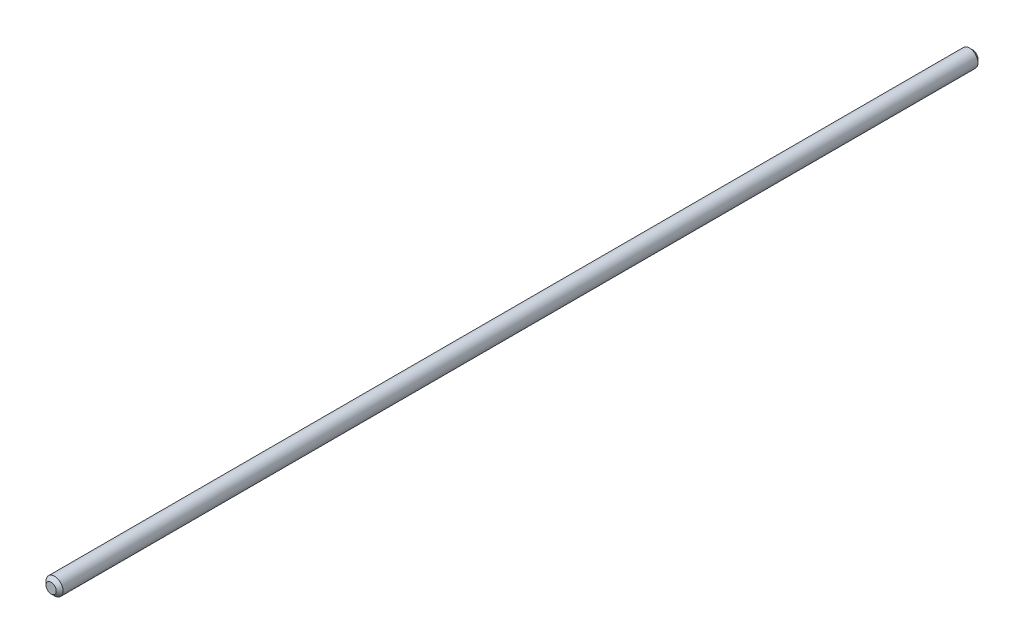
ISO-10303-21;
HEADER;
FILE_DESCRIPTION(('STEP AP214'),'2;1');
FILE_NAME('part.step','',(''),(''),'','','');
FILE_SCHEMA(('AUTOMOTIVE_DESIGN { 1 0 10303 214 1 1 1 1 }'));
ENDSEC;
DATA;
#1=APPLICATION_CONTEXT('core data for automotive mechanical design processes');
#2=APPLICATION_PROTOCOL_DEFINITION('international standard','automotive_design',2000,#1);
#3=PRODUCT_CONTEXT('',#1,'mechanical');
#4=PRODUCT('Part','Part','',(#3));
#5=PRODUCT_RELATED_PRODUCT_CATEGORY('part','',(#4));
#6=PRODUCT_DEFINITION_FORMATION('','',#4);
#7=PRODUCT_DEFINITION_CONTEXT('part definition',#1,'design');
#8=PRODUCT_DEFINITION('design','',#6,#7);
#9=PRODUCT_DEFINITION_SHAPE('','',#8);
#10=(LENGTH_UNIT() NAMED_UNIT(*) SI_UNIT(.MILLI.,.METRE.));
#11=(NAMED_UNIT(*) PLANE_ANGLE_UNIT() SI_UNIT($,.RADIAN.));
#12=(NAMED_UNIT(*) SI_UNIT($,.STERADIAN.) SOLID_ANGLE_UNIT());
#13=UNCERTAINTY_MEASURE_WITH_UNIT(LENGTH_MEASURE(1.E-05),#10,'distance_accuracy_value','');
#14=(GEOMETRIC_REPRESENTATION_CONTEXT(3) GLOBAL_UNCERTAINTY_ASSIGNED_CONTEXT((#13)) GLOBAL_UNIT_ASSIGNED_CONTEXT((#10,
#11,#12)) REPRESENTATION_CONTEXT('',''));
#15=CARTESIAN_POINT('',(0.,0.,0.));
#16=DIRECTION('',(0.,0.,1.));
#17=DIRECTION('',(1.,0.,0.));
#18=AXIS2_PLACEMENT_3D('',#15,#16,#17);
#19=CARTESIAN_POINT('',(0.,0.,-135.));
#20=DIRECTION('',(0.,0.,1.));
#21=DIRECTION('',(-1.,0.,0.));
#22=AXIS2_PLACEMENT_3D('',#19,#20,#21);
#23=CYLINDRICAL_SURFACE('',#22,1.25);
#24=CARTESIAN_POINT('',(0.,0.,-134.5));
#25=DIRECTION('',(0.,0.,1.));
#26=DIRECTION('',(1.,0.,0.));
#27=AXIS2_PLACEMENT_3D('',#24,#25,#26);
#28=CIRCLE('',#27,1.25);
#29=CARTESIAN_POINT('',(1.25,0.,-134.5));
#30=VERTEX_POINT('',#29);
#31=EDGE_CURVE('E48',#30,#30,#28,.F.);
#32=ORIENTED_EDGE('',*,*,#31,.F.);
#33=EDGE_LOOP('',(#32));
#34=FACE_BOUND('',#33,.T.);
#35=CARTESIAN_POINT('',(0.,0.,-0.5));
#36=DIRECTION('',(0.,0.,1.));
#37=DIRECTION('',(1.,0.,0.));
#38=AXIS2_PLACEMENT_3D('',#35,#36,#37);
#39=CIRCLE('',#38,1.25);
#40=CARTESIAN_POINT('',(1.25,0.,-0.5));
#41=VERTEX_POINT('',#40);
#42=EDGE_CURVE('E52',#41,#41,#39,.T.);
#43=ORIENTED_EDGE('',*,*,#42,.F.);
#44=EDGE_LOOP('',(#43));
#45=FACE_BOUND('',#44,.T.);
#46=ADVANCED_FACE('F41',(#34,#45),#23,.T.);
#47=CARTESIAN_POINT('',(0.,0.,-135.));
#48=DIRECTION('',(0.,0.,-1.));
#49=DIRECTION('',(1.,0.,0.));
#50=AXIS2_PLACEMENT_3D('',#47,#48,#49);
#51=PLANE('',#50);
#52=CARTESIAN_POINT('',(0.,0.,-135.));
#53=DIRECTION('',(0.,0.,1.));
#54=DIRECTION('',(1.,0.,0.));
#55=AXIS2_PLACEMENT_3D('',#52,#53,#54);
#56=CIRCLE('',#55,0.750000000000015);
#57=CARTESIAN_POINT('',(0.750000000000015,0.,-135.));
#58=VERTEX_POINT('',#57);
#59=EDGE_CURVE('E56',#58,#58,#56,.T.);
#60=ORIENTED_EDGE('',*,*,#59,.F.);
#61=EDGE_LOOP('',(#60));
#62=FACE_BOUND('',#61,.T.);
#63=ADVANCED_FACE('F64',(#62),#51,.T.);
#64=CARTESIAN_POINT('',(0.,0.,0.));
#65=DIRECTION('',(0.,0.,-1.));
#66=DIRECTION('',(1.,0.,0.));
#67=AXIS2_PLACEMENT_3D('',#64,#65,#66);
#68=PLANE('',#67);
#69=CARTESIAN_POINT('',(0.,0.,0.));
#70=DIRECTION('',(0.,0.,1.));
#71=DIRECTION('',(1.,0.,0.));
#72=AXIS2_PLACEMENT_3D('',#69,#70,#71);
#73=CIRCLE('',#72,0.750000000000014);
#74=CARTESIAN_POINT('',(0.750000000000014,0.,0.));
#75=VERTEX_POINT('',#74);
#76=EDGE_CURVE('E10',#75,#75,#73,.F.);
#77=ORIENTED_EDGE('',*,*,#76,.F.);
#78=EDGE_LOOP('',(#77));
#79=FACE_BOUND('',#78,.T.);
#80=ADVANCED_FACE('F66',(#79),#68,.F.);
#81=CARTESIAN_POINT('',(0.,0.,-135.));
#82=DIRECTION('',(0.,0.,1.));
#83=DIRECTION('',(-1.,0.,0.));
#84=AXIS2_PLACEMENT_3D('',#81,#82,#83);
#85=CONICAL_SURFACE('',#84,0.750000000000015,0.785398163397461);
#86=ORIENTED_EDGE('',*,*,#31,.T.);
#87=EDGE_LOOP('',(#86));
#88=FACE_BOUND('',#87,.T.);
#89=ORIENTED_EDGE('',*,*,#59,.T.);
#90=EDGE_LOOP('',(#89));
#91=FACE_BOUND('',#90,.T.);
#92=ADVANCED_FACE('F62',(#88,#91),#85,.T.);
#93=CARTESIAN_POINT('',(0.,0.,-0.5));
#94=DIRECTION('',(0.,0.,-1.));
#95=DIRECTION('',(1.,0.,0.));
#96=AXIS2_PLACEMENT_3D('',#93,#94,#95);
#97=CONICAL_SURFACE('',#96,1.25,0.785398163397433);
#98=ORIENTED_EDGE('',*,*,#76,.T.);
#99=EDGE_LOOP('',(#98));
#100=FACE_BOUND('',#99,.T.);
#101=ORIENTED_EDGE('',*,*,#42,.T.);
#102=EDGE_LOOP('',(#101));
#103=FACE_BOUND('',#102,.T.);
#104=ADVANCED_FACE('F43',(#100,#103),#97,.T.);
#105=CLOSED_SHELL('',(#46,#63,#80,#92,#104));
#106=MANIFOLD_SOLID_BREP('B2',#105);
#107=ADVANCED_BREP_SHAPE_REPRESENTATION('',(#18,#106),#14);
#108=SHAPE_DEFINITION_REPRESENTATION(#9,#107);
ENDSEC;
END-ISO-10303-21;
